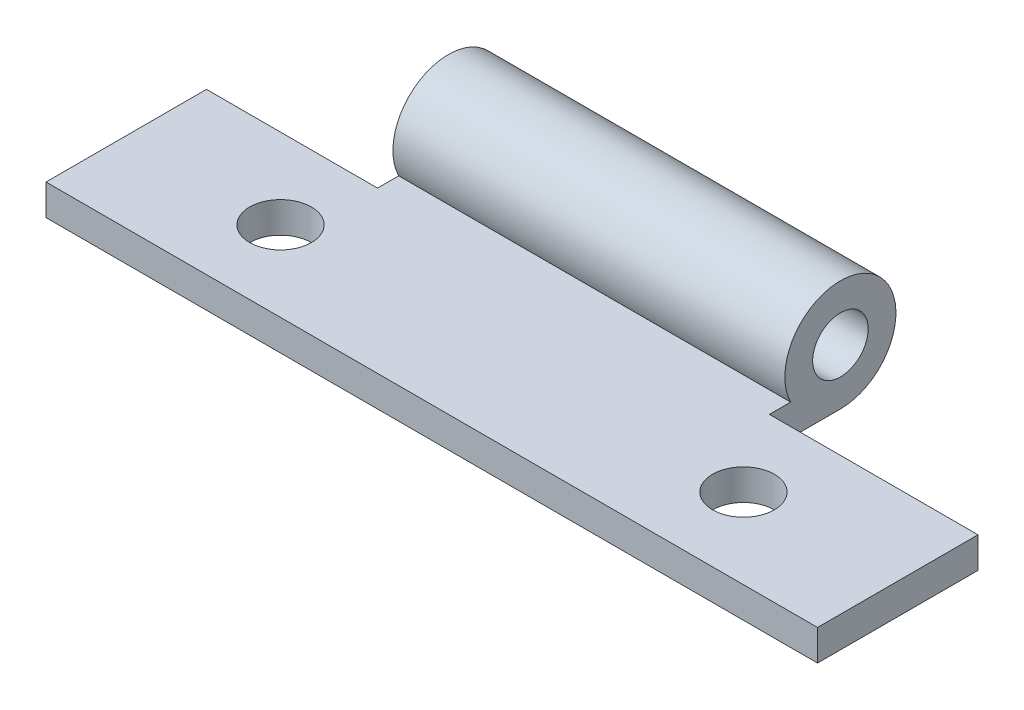
ISO-10303-21;
HEADER;
FILE_DESCRIPTION(('STEP AP214'),'2;1');
FILE_NAME('part.step','',(''),(''),'','','');
FILE_SCHEMA(('AUTOMOTIVE_DESIGN { 1 0 10303 214 1 1 1 1 }'));
ENDSEC;
DATA;
#1=APPLICATION_CONTEXT('core data for automotive mechanical design processes');
#2=APPLICATION_PROTOCOL_DEFINITION('international standard','automotive_design',2000,#1);
#3=PRODUCT_CONTEXT('',#1,'mechanical');
#4=PRODUCT('Part','Part','',(#3));
#5=PRODUCT_RELATED_PRODUCT_CATEGORY('part','',(#4));
#6=PRODUCT_DEFINITION_FORMATION('','',#4);
#7=PRODUCT_DEFINITION_CONTEXT('part definition',#1,'design');
#8=PRODUCT_DEFINITION('design','',#6,#7);
#9=PRODUCT_DEFINITION_SHAPE('','',#8);
#10=(LENGTH_UNIT() NAMED_UNIT(*) SI_UNIT(.MILLI.,.METRE.));
#11=(NAMED_UNIT(*) PLANE_ANGLE_UNIT() SI_UNIT($,.RADIAN.));
#12=(NAMED_UNIT(*) SI_UNIT($,.STERADIAN.) SOLID_ANGLE_UNIT());
#13=UNCERTAINTY_MEASURE_WITH_UNIT(LENGTH_MEASURE(1.E-05),#10,'distance_accuracy_value','');
#14=(GEOMETRIC_REPRESENTATION_CONTEXT(3) GLOBAL_UNCERTAINTY_ASSIGNED_CONTEXT((#13)) GLOBAL_UNIT_ASSIGNED_CONTEXT((#10,
#11,#12)) REPRESENTATION_CONTEXT('',''));
#15=CARTESIAN_POINT('',(0.,0.,0.));
#16=DIRECTION('',(0.,0.,1.));
#17=DIRECTION('',(1.,0.,0.));
#18=AXIS2_PLACEMENT_3D('',#15,#16,#17);
#19=CARTESIAN_POINT('',(25.,-0.20183193500589,14.2976916410333));
#20=DIRECTION('',(0.,-1.,0.));
#21=DIRECTION('',(0.,0.,-1.));
#22=AXIS2_PLACEMENT_3D('',#19,#20,#21);
#23=PLANE('',#22);
#24=CARTESIAN_POINT('',(20.,-0.201831935005892,11.6976916410333));
#25=DIRECTION('',(0.,-1.,0.));
#26=DIRECTION('',(0.,0.,-1.));
#27=AXIS2_PLACEMENT_3D('',#24,#25,#26);
#28=CIRCLE('',#27,1.);
#29=CARTESIAN_POINT('',(20.,-0.201831935005892,10.6976916410333));
#30=VERTEX_POINT('',#29);
#31=EDGE_CURVE('E130',#30,#30,#28,.T.);
#32=ORIENTED_EDGE('',*,*,#31,.T.);
#33=EDGE_LOOP('',(#32));
#34=FACE_BOUND('',#33,.T.);
#35=DIRECTION('',(1.,0.,0.));
#36=VECTOR('',#35,1.);
#37=CARTESIAN_POINT('',(25.,-0.20183193500589,9.09769164103326));
#38=LINE('',#37,#36);
#39=CARTESIAN_POINT('',(0.,-0.201831935005892,9.09769164103325));
#40=VERTEX_POINT('',#39);
#41=CARTESIAN_POINT('',(5.54133572569439,-0.201831935005892,9.09769164103325));
#42=VERTEX_POINT('',#41);
#43=EDGE_CURVE('E168',#40,#42,#38,.T.);
#44=ORIENTED_EDGE('',*,*,#43,.F.);
#45=DIRECTION('',(0.,0.,1.));
#46=VECTOR('',#45,1.);
#47=CARTESIAN_POINT('',(0.,-0.20183193500589,14.2976916410333));
#48=LINE('',#47,#46);
#49=CARTESIAN_POINT('',(0.,-0.20183193500589,14.2976916410333));
#50=VERTEX_POINT('',#49);
#51=EDGE_CURVE('E94',#40,#50,#48,.T.);
#52=ORIENTED_EDGE('',*,*,#51,.T.);
#53=DIRECTION('',(-1.,0.,0.));
#54=VECTOR('',#53,1.);
#55=CARTESIAN_POINT('',(25.,-0.20183193500589,14.2976916410333));
#56=LINE('',#55,#54);
#57=CARTESIAN_POINT('',(25.,-0.20183193500589,14.2976916410333));
#58=VERTEX_POINT('',#57);
#59=EDGE_CURVE('E89',#58,#50,#56,.T.);
#60=ORIENTED_EDGE('',*,*,#59,.F.);
#61=DIRECTION('',(0.,0.,1.));
#62=VECTOR('',#61,1.);
#63=CARTESIAN_POINT('',(25.,-0.20183193500589,14.2976916410333));
#64=LINE('',#63,#62);
#65=CARTESIAN_POINT('',(25.,-0.201831935005892,9.09769164103325));
#66=VERTEX_POINT('',#65);
#67=EDGE_CURVE('E109',#66,#58,#64,.T.);
#68=ORIENTED_EDGE('',*,*,#67,.F.);
#69=DIRECTION('',(1.,0.,0.));
#70=VECTOR('',#69,1.);
#71=CARTESIAN_POINT('',(25.,-0.20183193500589,9.09769164103325));
#72=LINE('',#71,#70);
#73=CARTESIAN_POINT('',(18.2413357256944,-0.201831935005892,9.09769164103325));
#74=VERTEX_POINT('',#73);
#75=EDGE_CURVE('E165',#74,#66,#72,.T.);
#76=ORIENTED_EDGE('',*,*,#75,.F.);
#77=DIRECTION('',(0.,0.,1.));
#78=VECTOR('',#77,1.);
#79=CARTESIAN_POINT('',(18.2413357256944,-0.20183193500589,14.2976916410333));
#80=LINE('',#79,#78);
#81=CARTESIAN_POINT('',(18.2413357256944,-0.20183193500589,8.41014319069296));
#82=VERTEX_POINT('',#81);
#83=EDGE_CURVE('E126',#82,#74,#80,.T.);
#84=ORIENTED_EDGE('',*,*,#83,.F.);
#85=DIRECTION('',(-1.,0.,0.));
#86=VECTOR('',#85,1.);
#87=CARTESIAN_POINT('',(25.,-0.20183193500589,8.41014319069296));
#88=LINE('',#87,#86);
#89=CARTESIAN_POINT('',(5.54133572569439,-0.20183193500589,8.41014319069296));
#90=VERTEX_POINT('',#89);
#91=EDGE_CURVE('E114',#82,#90,#88,.T.);
#92=ORIENTED_EDGE('',*,*,#91,.T.);
#93=DIRECTION('',(0.,0.,1.));
#94=VECTOR('',#93,1.);
#95=CARTESIAN_POINT('',(5.54133572569439,-0.20183193500589,14.2976916410333));
#96=LINE('',#95,#94);
#97=EDGE_CURVE('E162',#90,#42,#96,.T.);
#98=ORIENTED_EDGE('',*,*,#97,.T.);
#99=EDGE_LOOP('',(#44,#52,#60,#68,#76,#84,#92,#98));
#100=FACE_BOUND('',#99,.T.);
#101=CARTESIAN_POINT('',(5.,-0.201831935005892,11.6976916410333));
#102=DIRECTION('',(0.,-1.,0.));
#103=DIRECTION('',(0.,0.,-1.));
#104=AXIS2_PLACEMENT_3D('',#101,#102,#103);
#105=CIRCLE('',#104,1.);
#106=CARTESIAN_POINT('',(5.,-0.201831935005892,10.6976916410333));
#107=VERTEX_POINT('',#106);
#108=EDGE_CURVE('E138',#107,#107,#105,.F.);
#109=ORIENTED_EDGE('',*,*,#108,.F.);
#110=EDGE_LOOP('',(#109));
#111=FACE_BOUND('',#110,.T.);
#112=ADVANCED_FACE('F45',(#34,#100,#111),#23,.F.);
#113=CARTESIAN_POINT('',(25.,-1.20183193500589,6.79769164103325));
#114=DIRECTION('',(0.,1.,0.));
#115=DIRECTION('',(0.,0.,1.));
#116=AXIS2_PLACEMENT_3D('',#113,#114,#115);
#117=PLANE('',#116);
#118=CARTESIAN_POINT('',(20.,-1.20183193500589,11.6976916410333));
#119=DIRECTION('',(0.,1.,0.));
#120=DIRECTION('',(0.,0.,1.));
#121=AXIS2_PLACEMENT_3D('',#118,#119,#120);
#122=CIRCLE('',#121,1.);
#123=CARTESIAN_POINT('',(20.,-1.20183193500589,12.6976916410333));
#124=VERTEX_POINT('',#123);
#125=EDGE_CURVE('E128',#124,#124,#122,.T.);
#126=ORIENTED_EDGE('',*,*,#125,.T.);
#127=EDGE_LOOP('',(#126));
#128=FACE_BOUND('',#127,.T.);
#129=DIRECTION('',(-1.,0.,0.));
#130=VECTOR('',#129,1.);
#131=CARTESIAN_POINT('',(25.,-1.20183193500589,9.09769164103326));
#132=LINE('',#131,#130);
#133=CARTESIAN_POINT('',(5.54133572569439,-1.20183193500589,9.09769164103325));
#134=VERTEX_POINT('',#133);
#135=CARTESIAN_POINT('',(0.,-1.20183193500589,9.09769164103325));
#136=VERTEX_POINT('',#135);
#137=EDGE_CURVE('E11',#134,#136,#132,.T.);
#138=ORIENTED_EDGE('',*,*,#137,.F.);
#139=DIRECTION('',(0.,0.,-1.));
#140=VECTOR('',#139,1.);
#141=CARTESIAN_POINT('',(5.54133572569439,-1.20183193500589,6.79769164103325));
#142=LINE('',#141,#140);
#143=CARTESIAN_POINT('',(5.54133572569439,-1.20183193500589,6.79769164103325));
#144=VERTEX_POINT('',#143);
#145=EDGE_CURVE('E159',#134,#144,#142,.T.);
#146=ORIENTED_EDGE('',*,*,#145,.T.);
#147=DIRECTION('',(-1.,0.,0.));
#148=VECTOR('',#147,1.);
#149=CARTESIAN_POINT('',(25.,-1.20183193500589,6.79769164103325));
#150=LINE('',#149,#148);
#151=CARTESIAN_POINT('',(18.2413357256944,-1.20183193500589,6.79769164103325));
#152=VERTEX_POINT('',#151);
#153=EDGE_CURVE('E103',#152,#144,#150,.T.);
#154=ORIENTED_EDGE('',*,*,#153,.F.);
#155=DIRECTION('',(0.,0.,-1.));
#156=VECTOR('',#155,1.);
#157=CARTESIAN_POINT('',(18.2413357256944,-1.20183193500589,6.79769164103325));
#158=LINE('',#157,#156);
#159=CARTESIAN_POINT('',(18.2413357256944,-1.20183193500589,9.09769164103325));
#160=VERTEX_POINT('',#159);
#161=EDGE_CURVE('E153',#160,#152,#158,.T.);
#162=ORIENTED_EDGE('',*,*,#161,.F.);
#163=DIRECTION('',(-1.,0.,0.));
#164=VECTOR('',#163,1.);
#165=CARTESIAN_POINT('',(25.,-1.20183193500589,9.09769164103325));
#166=LINE('',#165,#164);
#167=CARTESIAN_POINT('',(25.,-1.20183193500589,9.09769164103325));
#168=VERTEX_POINT('',#167);
#169=EDGE_CURVE('E53',#168,#160,#166,.T.);
#170=ORIENTED_EDGE('',*,*,#169,.F.);
#171=DIRECTION('',(0.,0.,-1.));
#172=VECTOR('',#171,1.);
#173=CARTESIAN_POINT('',(25.,-1.20183193500589,6.79769164103325));
#174=LINE('',#173,#172);
#175=CARTESIAN_POINT('',(25.,-1.20183193500589,14.2976916410333));
#176=VERTEX_POINT('',#175);
#177=EDGE_CURVE('E102',#176,#168,#174,.T.);
#178=ORIENTED_EDGE('',*,*,#177,.F.);
#179=DIRECTION('',(-1.,0.,0.));
#180=VECTOR('',#179,1.);
#181=CARTESIAN_POINT('',(25.,-1.20183193500589,14.2976916410333));
#182=LINE('',#181,#180);
#183=CARTESIAN_POINT('',(0.,-1.20183193500589,14.2976916410333));
#184=VERTEX_POINT('',#183);
#185=EDGE_CURVE('E86',#176,#184,#182,.T.);
#186=ORIENTED_EDGE('',*,*,#185,.T.);
#187=DIRECTION('',(0.,0.,-1.));
#188=VECTOR('',#187,1.);
#189=CARTESIAN_POINT('',(0.,-1.20183193500589,6.79769164103325));
#190=LINE('',#189,#188);
#191=EDGE_CURVE('E93',#184,#136,#190,.T.);
#192=ORIENTED_EDGE('',*,*,#191,.T.);
#193=EDGE_LOOP('',(#138,#146,#154,#162,#170,#178,#186,#192));
#194=FACE_BOUND('',#193,.T.);
#195=CARTESIAN_POINT('',(5.,-1.20183193500589,11.6976916410333));
#196=DIRECTION('',(0.,1.,0.));
#197=DIRECTION('',(0.,0.,1.));
#198=AXIS2_PLACEMENT_3D('',#195,#196,#197);
#199=CIRCLE('',#198,1.);
#200=CARTESIAN_POINT('',(5.,-1.20183193500589,12.6976916410333));
#201=VERTEX_POINT('',#200);
#202=EDGE_CURVE('E48',#201,#201,#199,.F.);
#203=ORIENTED_EDGE('',*,*,#202,.F.);
#204=EDGE_LOOP('',(#203));
#205=FACE_BOUND('',#204,.T.);
#206=ADVANCED_FACE('F99',(#128,#194,#205),#117,.F.);
#207=CARTESIAN_POINT('',(25.,0.598168064994111,6.79769164103325));
#208=DIRECTION('',(1.,0.,0.));
#209=DIRECTION('',(0.,0.,-1.));
#210=AXIS2_PLACEMENT_3D('',#207,#208,#209);
#211=PLANE('',#210);
#212=ORIENTED_EDGE('',*,*,#177,.T.);
#213=DIRECTION('',(0.,-1.,0.));
#214=VECTOR('',#213,1.);
#215=CARTESIAN_POINT('',(25.,25.,9.09769164103325));
#216=LINE('',#215,#214);
#217=EDGE_CURVE('E142',#66,#168,#216,.T.);
#218=ORIENTED_EDGE('',*,*,#217,.F.);
#219=ORIENTED_EDGE('',*,*,#67,.T.);
#220=DIRECTION('',(0.,-1.,0.));
#221=VECTOR('',#220,1.);
#222=CARTESIAN_POINT('',(25.,-1.20183193500589,14.2976916410333));
#223=LINE('',#222,#221);
#224=EDGE_CURVE('E70',#58,#176,#223,.T.);
#225=ORIENTED_EDGE('',*,*,#224,.T.);
#226=EDGE_LOOP('',(#212,#218,#219,#225));
#227=FACE_BOUND('',#226,.T.);
#228=ADVANCED_FACE('F209',(#227),#211,.T.);
#229=CARTESIAN_POINT('',(0.,0.598168064994111,6.79769164103325));
#230=DIRECTION('',(1.,0.,0.));
#231=DIRECTION('',(0.,0.,-1.));
#232=AXIS2_PLACEMENT_3D('',#229,#230,#231);
#233=PLANE('',#232);
#234=DIRECTION('',(0.,-1.,0.));
#235=VECTOR('',#234,1.);
#236=CARTESIAN_POINT('',(0.,25.,9.09769164103325));
#237=LINE('',#236,#235);
#238=EDGE_CURVE('E108',#40,#136,#237,.T.);
#239=ORIENTED_EDGE('',*,*,#238,.T.);
#240=ORIENTED_EDGE('',*,*,#191,.F.);
#241=DIRECTION('',(0.,-1.,0.));
#242=VECTOR('',#241,1.);
#243=CARTESIAN_POINT('',(0.,-1.20183193500589,14.2976916410333));
#244=LINE('',#243,#242);
#245=EDGE_CURVE('E83',#50,#184,#244,.T.);
#246=ORIENTED_EDGE('',*,*,#245,.F.);
#247=ORIENTED_EDGE('',*,*,#51,.F.);
#248=EDGE_LOOP('',(#239,#240,#246,#247));
#249=FACE_BOUND('',#248,.T.);
#250=ADVANCED_FACE('F106',(#249),#233,.F.);
#251=CARTESIAN_POINT('',(25.,0.598168064994111,6.79769164103325));
#252=DIRECTION('',(-1.,0.,0.));
#253=DIRECTION('',(0.,0.,1.));
#254=AXIS2_PLACEMENT_3D('',#251,#252,#253);
#255=CYLINDRICAL_SURFACE('',#254,1.8);
#256=ORIENTED_EDGE('',*,*,#153,.T.);
#257=CARTESIAN_POINT('',(5.54133572569439,0.598168064994111,6.79769164103325));
#258=DIRECTION('',(1.,0.,0.));
#259=DIRECTION('',(0.,0.,-1.));
#260=AXIS2_PLACEMENT_3D('',#257,#258,#259);
#261=CIRCLE('',#260,1.8);
#262=EDGE_CURVE('E125',#144,#90,#261,.T.);
#263=ORIENTED_EDGE('',*,*,#262,.T.);
#264=ORIENTED_EDGE('',*,*,#91,.F.);
#265=CARTESIAN_POINT('',(18.2413357256944,0.598168064994111,6.79769164103325));
#266=DIRECTION('',(1.,0.,0.));
#267=DIRECTION('',(0.,0.,-1.));
#268=AXIS2_PLACEMENT_3D('',#265,#266,#267);
#269=CIRCLE('',#268,1.8);
#270=EDGE_CURVE('E61',#152,#82,#269,.T.);
#271=ORIENTED_EDGE('',*,*,#270,.F.);
#272=EDGE_LOOP('',(#256,#263,#264,#271));
#273=FACE_BOUND('',#272,.T.);
#274=ADVANCED_FACE('F211',(#273),#255,.T.);
#275=CARTESIAN_POINT('',(25.,-1.20183193500589,14.2976916410333));
#276=DIRECTION('',(0.,0.,-1.));
#277=DIRECTION('',(-1.,0.,0.));
#278=AXIS2_PLACEMENT_3D('',#275,#276,#277);
#279=PLANE('',#278);
#280=ORIENTED_EDGE('',*,*,#245,.T.);
#281=ORIENTED_EDGE('',*,*,#185,.F.);
#282=ORIENTED_EDGE('',*,*,#224,.F.);
#283=ORIENTED_EDGE('',*,*,#59,.T.);
#284=EDGE_LOOP('',(#280,#281,#282,#283));
#285=FACE_BOUND('',#284,.T.);
#286=ADVANCED_FACE('F85',(#285),#279,.F.);
#287=CARTESIAN_POINT('',(0.,25.,9.09769164103325));
#288=DIRECTION('',(0.,0.,-1.));
#289=DIRECTION('',(-1.,0.,0.));
#290=AXIS2_PLACEMENT_3D('',#287,#288,#289);
#291=PLANE('',#290);
#292=ORIENTED_EDGE('',*,*,#75,.T.);
#293=ORIENTED_EDGE('',*,*,#217,.T.);
#294=ORIENTED_EDGE('',*,*,#169,.T.);
#295=DIRECTION('',(0.,-1.,0.));
#296=VECTOR('',#295,1.);
#297=CARTESIAN_POINT('',(18.2413357256944,25.,9.09769164103325));
#298=LINE('',#297,#296);
#299=EDGE_CURVE('E146',#74,#160,#298,.T.);
#300=ORIENTED_EDGE('',*,*,#299,.F.);
#301=EDGE_LOOP('',(#292,#293,#294,#300));
#302=FACE_BOUND('',#301,.T.);
#303=ADVANCED_FACE('F207',(#302),#291,.T.);
#304=CARTESIAN_POINT('',(18.2413357256944,25.,0.));
#305=DIRECTION('',(1.,0.,0.));
#306=DIRECTION('',(0.,0.,-1.));
#307=AXIS2_PLACEMENT_3D('',#304,#305,#306);
#308=PLANE('',#307);
#309=CARTESIAN_POINT('',(18.2413357256944,0.598168064994111,6.79769164103325));
#310=DIRECTION('',(1.,0.,0.));
#311=DIRECTION('',(0.,0.,-1.));
#312=AXIS2_PLACEMENT_3D('',#309,#310,#311);
#313=CIRCLE('',#312,0.899999999999999);
#314=CARTESIAN_POINT('',(18.2413357256944,0.598168064994111,5.89769164103325));
#315=VERTEX_POINT('',#314);
#316=EDGE_CURVE('E119',#315,#315,#313,.T.);
#317=ORIENTED_EDGE('',*,*,#316,.F.);
#318=EDGE_LOOP('',(#317));
#319=FACE_BOUND('',#318,.T.);
#320=ORIENTED_EDGE('',*,*,#83,.T.);
#321=ORIENTED_EDGE('',*,*,#299,.T.);
#322=ORIENTED_EDGE('',*,*,#161,.T.);
#323=ORIENTED_EDGE('',*,*,#270,.T.);
#324=EDGE_LOOP('',(#320,#321,#322,#323));
#325=FACE_BOUND('',#324,.T.);
#326=ADVANCED_FACE('F203',(#319,#325),#308,.T.);
#327=CARTESIAN_POINT('',(0.,25.,9.09769164103325));
#328=DIRECTION('',(0.,0.,-1.));
#329=DIRECTION('',(-1.,0.,0.));
#330=AXIS2_PLACEMENT_3D('',#327,#328,#329);
#331=PLANE('',#330);
#332=ORIENTED_EDGE('',*,*,#43,.T.);
#333=DIRECTION('',(0.,-1.,0.));
#334=VECTOR('',#333,1.);
#335=CARTESIAN_POINT('',(5.54133572569439,25.,9.09769164103325));
#336=LINE('',#335,#334);
#337=EDGE_CURVE('E143',#42,#134,#336,.T.);
#338=ORIENTED_EDGE('',*,*,#337,.T.);
#339=ORIENTED_EDGE('',*,*,#137,.T.);
#340=ORIENTED_EDGE('',*,*,#238,.F.);
#341=EDGE_LOOP('',(#332,#338,#339,#340));
#342=FACE_BOUND('',#341,.T.);
#343=ADVANCED_FACE('F215',(#342),#331,.T.);
#344=CARTESIAN_POINT('',(5.54133572569439,25.,0.));
#345=DIRECTION('',(1.,0.,0.));
#346=DIRECTION('',(0.,0.,-1.));
#347=AXIS2_PLACEMENT_3D('',#344,#345,#346);
#348=PLANE('',#347);
#349=CARTESIAN_POINT('',(5.54133572569439,0.598168064994111,6.79769164103325));
#350=DIRECTION('',(1.,0.,0.));
#351=DIRECTION('',(0.,0.,-1.));
#352=AXIS2_PLACEMENT_3D('',#349,#350,#351);
#353=CIRCLE('',#352,0.899999999999999);
#354=CARTESIAN_POINT('',(5.54133572569439,0.598168064994111,5.89769164103325));
#355=VERTEX_POINT('',#354);
#356=EDGE_CURVE('E122',#355,#355,#353,.T.);
#357=ORIENTED_EDGE('',*,*,#356,.T.);
#358=EDGE_LOOP('',(#357));
#359=FACE_BOUND('',#358,.T.);
#360=ORIENTED_EDGE('',*,*,#262,.F.);
#361=ORIENTED_EDGE('',*,*,#145,.F.);
#362=ORIENTED_EDGE('',*,*,#337,.F.);
#363=ORIENTED_EDGE('',*,*,#97,.F.);
#364=EDGE_LOOP('',(#360,#361,#362,#363));
#365=FACE_BOUND('',#364,.T.);
#366=ADVANCED_FACE('F214',(#359,#365),#348,.F.);
#367=CARTESIAN_POINT('',(25.,0.598168064994111,6.79769164103325));
#368=DIRECTION('',(-1.,0.,0.));
#369=DIRECTION('',(0.,0.,1.));
#370=AXIS2_PLACEMENT_3D('',#367,#368,#369);
#371=CYLINDRICAL_SURFACE('',#370,0.899999999999999);
#372=ORIENTED_EDGE('',*,*,#356,.F.);
#373=EDGE_LOOP('',(#372));
#374=FACE_BOUND('',#373,.T.);
#375=ORIENTED_EDGE('',*,*,#316,.T.);
#376=EDGE_LOOP('',(#375));
#377=FACE_BOUND('',#376,.T.);
#378=ADVANCED_FACE('F222',(#374,#377),#371,.F.);
#379=CARTESIAN_POINT('',(20.,24.7981680649941,11.6976916410333));
#380=DIRECTION('',(0.,-1.,0.));
#381=DIRECTION('',(0.,0.,-1.));
#382=AXIS2_PLACEMENT_3D('',#379,#380,#381);
#383=CYLINDRICAL_SURFACE('',#382,1.);
#384=ORIENTED_EDGE('',*,*,#125,.F.);
#385=EDGE_LOOP('',(#384));
#386=FACE_BOUND('',#385,.T.);
#387=ORIENTED_EDGE('',*,*,#31,.F.);
#388=EDGE_LOOP('',(#387));
#389=FACE_BOUND('',#388,.T.);
#390=ADVANCED_FACE('F252',(#386,#389),#383,.F.);
#391=CARTESIAN_POINT('',(5.,24.7981680649941,11.6976916410333));
#392=DIRECTION('',(0.,-1.,0.));
#393=DIRECTION('',(0.,0.,-1.));
#394=AXIS2_PLACEMENT_3D('',#391,#392,#393);
#395=CYLINDRICAL_SURFACE('',#394,1.);
#396=ORIENTED_EDGE('',*,*,#202,.T.);
#397=EDGE_LOOP('',(#396));
#398=FACE_BOUND('',#397,.T.);
#399=ORIENTED_EDGE('',*,*,#108,.T.);
#400=EDGE_LOOP('',(#399));
#401=FACE_BOUND('',#400,.T.);
#402=ADVANCED_FACE('F256',(#398,#401),#395,.F.);
#403=CLOSED_SHELL('',(#112,#206,#228,#250,#274,#286,#303,#326,#343,#366,#378,#390,#402));
#404=MANIFOLD_SOLID_BREP('B2',#403);
#405=ADVANCED_BREP_SHAPE_REPRESENTATION('',(#18,#404),#14);
#406=SHAPE_DEFINITION_REPRESENTATION(#9,#405);
ENDSEC;
END-ISO-10303-21;
